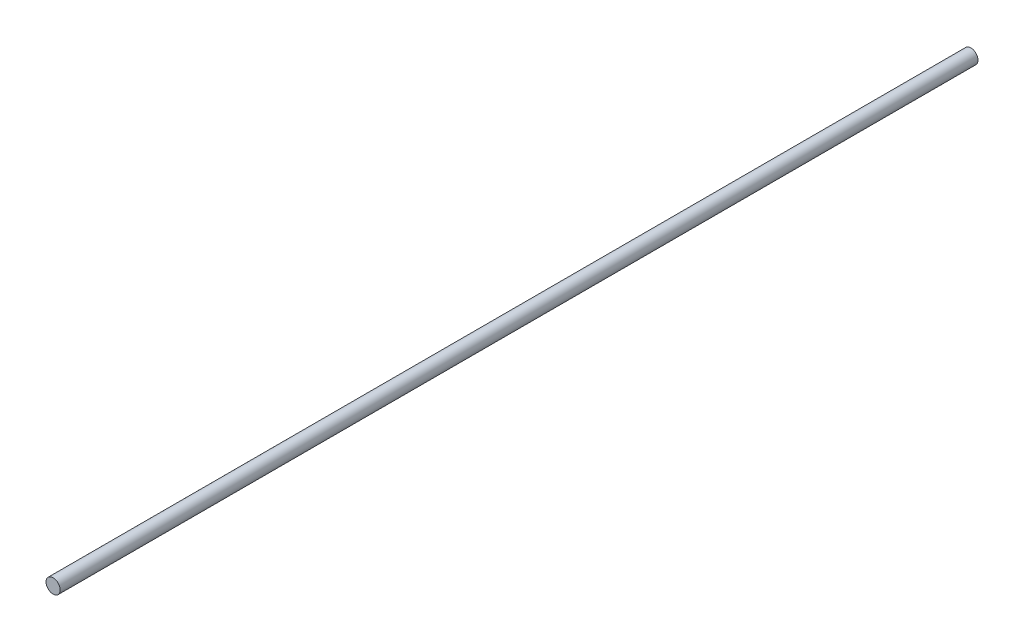
ISO-10303-21;
HEADER;
FILE_DESCRIPTION(('STEP AP214'),'2;1');
FILE_NAME('part.step','',(''),(''),'','','');
FILE_SCHEMA(('AUTOMOTIVE_DESIGN { 1 0 10303 214 1 1 1 1 }'));
ENDSEC;
DATA;
#1=APPLICATION_CONTEXT('core data for automotive mechanical design processes');
#2=APPLICATION_PROTOCOL_DEFINITION('international standard','automotive_design',2000,#1);
#3=PRODUCT_CONTEXT('',#1,'mechanical');
#4=PRODUCT('Part','Part','',(#3));
#5=PRODUCT_RELATED_PRODUCT_CATEGORY('part','',(#4));
#6=PRODUCT_DEFINITION_FORMATION('','',#4);
#7=PRODUCT_DEFINITION_CONTEXT('part definition',#1,'design');
#8=PRODUCT_DEFINITION('design','',#6,#7);
#9=PRODUCT_DEFINITION_SHAPE('','',#8);
#10=(LENGTH_UNIT() NAMED_UNIT(*) SI_UNIT(.MILLI.,.METRE.));
#11=(NAMED_UNIT(*) PLANE_ANGLE_UNIT() SI_UNIT($,.RADIAN.));
#12=(NAMED_UNIT(*) SI_UNIT($,.STERADIAN.) SOLID_ANGLE_UNIT());
#13=UNCERTAINTY_MEASURE_WITH_UNIT(LENGTH_MEASURE(1.E-05),#10,'distance_accuracy_value','');
#14=(GEOMETRIC_REPRESENTATION_CONTEXT(3) GLOBAL_UNCERTAINTY_ASSIGNED_CONTEXT((#13)) GLOBAL_UNIT_ASSIGNED_CONTEXT((#10,
#11,#12)) REPRESENTATION_CONTEXT('',''));
#15=CARTESIAN_POINT('',(0.,0.,0.));
#16=DIRECTION('',(0.,0.,1.));
#17=DIRECTION('',(1.,0.,0.));
#18=AXIS2_PLACEMENT_3D('',#15,#16,#17);
#19=CARTESIAN_POINT('',(0.,0.,310.));
#20=DIRECTION('',(0.,0.,-1.));
#21=DIRECTION('',(-1.,0.,0.));
#22=AXIS2_PLACEMENT_3D('',#19,#20,#21);
#23=CYLINDRICAL_SURFACE('',#22,2.4);
#24=CARTESIAN_POINT('',(0.,0.,310.));
#25=DIRECTION('',(0.,0.,1.));
#26=DIRECTION('',(1.,0.,0.));
#27=AXIS2_PLACEMENT_3D('',#24,#25,#26);
#28=CIRCLE('',#27,2.4);
#29=CARTESIAN_POINT('',(2.4,0.,310.));
#30=VERTEX_POINT('',#29);
#31=EDGE_CURVE('E10',#30,#30,#28,.T.);
#32=ORIENTED_EDGE('',*,*,#31,.F.);
#33=EDGE_LOOP('',(#32));
#34=FACE_BOUND('',#33,.T.);
#35=CARTESIAN_POINT('',(0.,0.,0.));
#36=DIRECTION('',(0.,0.,1.));
#37=DIRECTION('',(1.,0.,0.));
#38=AXIS2_PLACEMENT_3D('',#35,#36,#37);
#39=CIRCLE('',#38,2.4);
#40=CARTESIAN_POINT('',(2.4,0.,0.));
#41=VERTEX_POINT('',#40);
#42=EDGE_CURVE('E40',#41,#41,#39,.T.);
#43=ORIENTED_EDGE('',*,*,#42,.T.);
#44=EDGE_LOOP('',(#43));
#45=FACE_BOUND('',#44,.T.);
#46=ADVANCED_FACE('F37',(#34,#45),#23,.T.);
#47=CARTESIAN_POINT('',(0.,0.,310.));
#48=DIRECTION('',(0.,0.,1.));
#49=DIRECTION('',(1.,0.,0.));
#50=AXIS2_PLACEMENT_3D('',#47,#48,#49);
#51=PLANE('',#50);
#52=ORIENTED_EDGE('',*,*,#31,.T.);
#53=EDGE_LOOP('',(#52));
#54=FACE_BOUND('',#53,.T.);
#55=ADVANCED_FACE('F54',(#54),#51,.T.);
#56=CARTESIAN_POINT('',(0.,0.,0.));
#57=DIRECTION('',(0.,0.,1.));
#58=DIRECTION('',(1.,0.,0.));
#59=AXIS2_PLACEMENT_3D('',#56,#57,#58);
#60=PLANE('',#59);
#61=ORIENTED_EDGE('',*,*,#42,.F.);
#62=EDGE_LOOP('',(#61));
#63=FACE_BOUND('',#62,.T.);
#64=ADVANCED_FACE('F52',(#63),#60,.F.);
#65=CLOSED_SHELL('',(#46,#55,#64));
#66=MANIFOLD_SOLID_BREP('B2',#65);
#67=ADVANCED_BREP_SHAPE_REPRESENTATION('',(#18,#66),#14);
#68=SHAPE_DEFINITION_REPRESENTATION(#9,#67);
ENDSEC;
END-ISO-10303-21;
